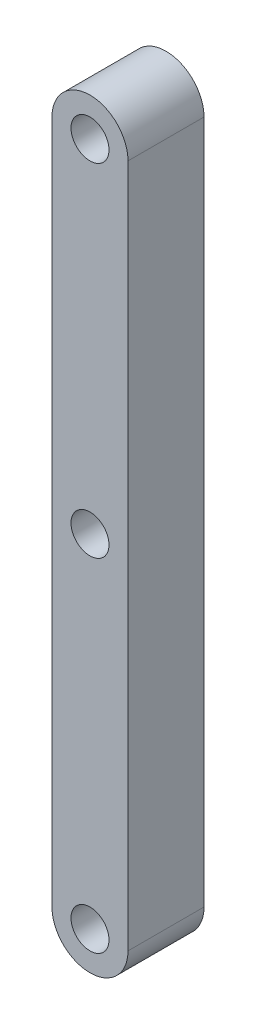
ISO-10303-21;
HEADER;
FILE_DESCRIPTION(('STEP AP214'),'2;1');
FILE_NAME('part.step','',(''),(''),'','','');
FILE_SCHEMA(('AUTOMOTIVE_DESIGN { 1 0 10303 214 1 1 1 1 }'));
ENDSEC;
DATA;
#1=APPLICATION_CONTEXT('core data for automotive mechanical design processes');
#2=APPLICATION_PROTOCOL_DEFINITION('international standard','automotive_design',2000,#1);
#3=PRODUCT_CONTEXT('',#1,'mechanical');
#4=PRODUCT('Part','Part','',(#3));
#5=PRODUCT_RELATED_PRODUCT_CATEGORY('part','',(#4));
#6=PRODUCT_DEFINITION_FORMATION('','',#4);
#7=PRODUCT_DEFINITION_CONTEXT('part definition',#1,'design');
#8=PRODUCT_DEFINITION('design','',#6,#7);
#9=PRODUCT_DEFINITION_SHAPE('','',#8);
#10=(LENGTH_UNIT() NAMED_UNIT(*) SI_UNIT(.MILLI.,.METRE.));
#11=(NAMED_UNIT(*) PLANE_ANGLE_UNIT() SI_UNIT($,.RADIAN.));
#12=(NAMED_UNIT(*) SI_UNIT($,.STERADIAN.) SOLID_ANGLE_UNIT());
#13=UNCERTAINTY_MEASURE_WITH_UNIT(LENGTH_MEASURE(1.E-05),#10,'distance_accuracy_value','');
#14=(GEOMETRIC_REPRESENTATION_CONTEXT(3) GLOBAL_UNCERTAINTY_ASSIGNED_CONTEXT((#13)) GLOBAL_UNIT_ASSIGNED_CONTEXT((#10,
#11,#12)) REPRESENTATION_CONTEXT('',''));
#15=CARTESIAN_POINT('',(0.,0.,0.));
#16=DIRECTION('',(0.,0.,1.));
#17=DIRECTION('',(1.,0.,0.));
#18=AXIS2_PLACEMENT_3D('',#15,#16,#17);
#19=CARTESIAN_POINT('',(0.,0.,10.));
#20=DIRECTION('',(0.,0.,-1.));
#21=DIRECTION('',(-1.,0.,0.));
#22=AXIS2_PLACEMENT_3D('',#19,#20,#21);
#23=CYLINDRICAL_SURFACE('',#22,5.);
#24=CARTESIAN_POINT('',(0.,0.,0.));
#25=DIRECTION('',(0.,0.,1.));
#26=DIRECTION('',(1.,0.,0.));
#27=AXIS2_PLACEMENT_3D('',#24,#25,#26);
#28=CIRCLE('',#27,5.);
#29=CARTESIAN_POINT('',(-5.,0.,0.));
#30=VERTEX_POINT('',#29);
#31=CARTESIAN_POINT('',(5.,0.,0.));
#32=VERTEX_POINT('',#31);
#33=EDGE_CURVE('E112',#30,#32,#28,.T.);
#34=ORIENTED_EDGE('',*,*,#33,.T.);
#35=DIRECTION('',(0.,0.,-1.));
#36=VECTOR('',#35,1.);
#37=CARTESIAN_POINT('',(5.,0.,10.));
#38=LINE('',#37,#36);
#39=CARTESIAN_POINT('',(5.,0.,10.));
#40=VERTEX_POINT('',#39);
#41=EDGE_CURVE('E11',#40,#32,#38,.T.);
#42=ORIENTED_EDGE('',*,*,#41,.F.);
#43=CARTESIAN_POINT('',(0.,0.,10.));
#44=DIRECTION('',(0.,0.,1.));
#45=DIRECTION('',(1.,0.,0.));
#46=AXIS2_PLACEMENT_3D('',#43,#44,#45);
#47=CIRCLE('',#46,5.);
#48=CARTESIAN_POINT('',(-5.,0.,10.));
#49=VERTEX_POINT('',#48);
#50=EDGE_CURVE('E96',#49,#40,#47,.T.);
#51=ORIENTED_EDGE('',*,*,#50,.F.);
#52=DIRECTION('',(0.,0.,-1.));
#53=VECTOR('',#52,1.);
#54=CARTESIAN_POINT('',(-5.,0.,10.));
#55=LINE('',#54,#53);
#56=EDGE_CURVE('E108',#49,#30,#55,.T.);
#57=ORIENTED_EDGE('',*,*,#56,.T.);
#58=EDGE_LOOP('',(#34,#42,#51,#57));
#59=FACE_BOUND('',#58,.T.);
#60=ADVANCED_FACE('F44',(#59),#23,.T.);
#61=CARTESIAN_POINT('',(5.,0.,10.));
#62=DIRECTION('',(-1.,0.,0.));
#63=DIRECTION('',(0.,0.,1.));
#64=AXIS2_PLACEMENT_3D('',#61,#62,#63);
#65=PLANE('',#64);
#66=DIRECTION('',(0.,1.,0.));
#67=VECTOR('',#66,1.);
#68=CARTESIAN_POINT('',(5.,0.,0.));
#69=LINE('',#68,#67);
#70=CARTESIAN_POINT('',(5.,90.,0.));
#71=VERTEX_POINT('',#70);
#72=EDGE_CURVE('E101',#32,#71,#69,.T.);
#73=ORIENTED_EDGE('',*,*,#72,.T.);
#74=DIRECTION('',(0.,0.,-1.));
#75=VECTOR('',#74,1.);
#76=CARTESIAN_POINT('',(5.,90.,10.));
#77=LINE('',#76,#75);
#78=CARTESIAN_POINT('',(5.,90.,10.));
#79=VERTEX_POINT('',#78);
#80=EDGE_CURVE('E53',#79,#71,#77,.T.);
#81=ORIENTED_EDGE('',*,*,#80,.F.);
#82=DIRECTION('',(0.,1.,0.));
#83=VECTOR('',#82,1.);
#84=CARTESIAN_POINT('',(5.,0.,10.));
#85=LINE('',#84,#83);
#86=EDGE_CURVE('E91',#40,#79,#85,.T.);
#87=ORIENTED_EDGE('',*,*,#86,.F.);
#88=ORIENTED_EDGE('',*,*,#41,.T.);
#89=EDGE_LOOP('',(#73,#81,#87,#88));
#90=FACE_BOUND('',#89,.T.);
#91=ADVANCED_FACE('F100',(#90),#65,.F.);
#92=CARTESIAN_POINT('',(0.,90.,10.));
#93=DIRECTION('',(0.,0.,-1.));
#94=DIRECTION('',(-1.,0.,0.));
#95=AXIS2_PLACEMENT_3D('',#92,#93,#94);
#96=CYLINDRICAL_SURFACE('',#95,5.);
#97=CARTESIAN_POINT('',(0.,90.,0.));
#98=DIRECTION('',(0.,0.,1.));
#99=DIRECTION('',(1.,0.,0.));
#100=AXIS2_PLACEMENT_3D('',#97,#98,#99);
#101=CIRCLE('',#100,5.);
#102=CARTESIAN_POINT('',(-5.,90.,0.));
#103=VERTEX_POINT('',#102);
#104=EDGE_CURVE('E78',#71,#103,#101,.T.);
#105=ORIENTED_EDGE('',*,*,#104,.T.);
#106=DIRECTION('',(0.,0.,-1.));
#107=VECTOR('',#106,1.);
#108=CARTESIAN_POINT('',(-5.,90.,10.));
#109=LINE('',#108,#107);
#110=CARTESIAN_POINT('',(-5.,90.,10.));
#111=VERTEX_POINT('',#110);
#112=EDGE_CURVE('E103',#111,#103,#109,.T.);
#113=ORIENTED_EDGE('',*,*,#112,.F.);
#114=CARTESIAN_POINT('',(0.,90.,10.));
#115=DIRECTION('',(0.,0.,1.));
#116=DIRECTION('',(1.,0.,0.));
#117=AXIS2_PLACEMENT_3D('',#114,#115,#116);
#118=CIRCLE('',#117,5.);
#119=EDGE_CURVE('E94',#79,#111,#118,.T.);
#120=ORIENTED_EDGE('',*,*,#119,.F.);
#121=ORIENTED_EDGE('',*,*,#80,.T.);
#122=EDGE_LOOP('',(#105,#113,#120,#121));
#123=FACE_BOUND('',#122,.T.);
#124=ADVANCED_FACE('F104',(#123),#96,.T.);
#125=CARTESIAN_POINT('',(-5.,0.,10.));
#126=DIRECTION('',(1.,0.,0.));
#127=DIRECTION('',(0.,1.,0.));
#128=AXIS2_PLACEMENT_3D('',#125,#126,#127);
#129=PLANE('',#128);
#130=DIRECTION('',(0.,-1.,0.));
#131=VECTOR('',#130,1.);
#132=CARTESIAN_POINT('',(-5.,0.,0.));
#133=LINE('',#132,#131);
#134=EDGE_CURVE('E84',#103,#30,#133,.T.);
#135=ORIENTED_EDGE('',*,*,#134,.T.);
#136=ORIENTED_EDGE('',*,*,#56,.F.);
#137=DIRECTION('',(0.,-1.,0.));
#138=VECTOR('',#137,1.);
#139=CARTESIAN_POINT('',(-5.,0.,10.));
#140=LINE('',#139,#138);
#141=EDGE_CURVE('E61',#111,#49,#140,.T.);
#142=ORIENTED_EDGE('',*,*,#141,.F.);
#143=ORIENTED_EDGE('',*,*,#112,.T.);
#144=EDGE_LOOP('',(#135,#136,#142,#143));
#145=FACE_BOUND('',#144,.T.);
#146=ADVANCED_FACE('F126',(#145),#129,.F.);
#147=CARTESIAN_POINT('',(0.,0.,10.));
#148=DIRECTION('',(0.,0.,1.));
#149=DIRECTION('',(1.,0.,0.));
#150=AXIS2_PLACEMENT_3D('',#147,#148,#149);
#151=PLANE('',#150);
#152=CARTESIAN_POINT('',(0.,0.,10.));
#153=DIRECTION('',(0.,0.,1.));
#154=DIRECTION('',(1.,0.,0.));
#155=AXIS2_PLACEMENT_3D('',#152,#153,#154);
#156=CIRCLE('',#155,2.5);
#157=CARTESIAN_POINT('',(2.5,0.,10.));
#158=VERTEX_POINT('',#157);
#159=EDGE_CURVE('E149',#158,#158,#156,.T.);
#160=ORIENTED_EDGE('',*,*,#159,.F.);
#161=EDGE_LOOP('',(#160));
#162=FACE_BOUND('',#161,.T.);
#163=CARTESIAN_POINT('',(0.,90.,10.));
#164=DIRECTION('',(0.,0.,1.));
#165=DIRECTION('',(1.,0.,0.));
#166=AXIS2_PLACEMENT_3D('',#163,#164,#165);
#167=CIRCLE('',#166,2.5);
#168=CARTESIAN_POINT('',(2.5,90.,10.));
#169=VERTEX_POINT('',#168);
#170=EDGE_CURVE('E141',#169,#169,#167,.T.);
#171=ORIENTED_EDGE('',*,*,#170,.F.);
#172=EDGE_LOOP('',(#171));
#173=FACE_BOUND('',#172,.T.);
#174=CARTESIAN_POINT('',(0.,45.,10.));
#175=DIRECTION('',(0.,0.,-1.));
#176=DIRECTION('',(-1.,0.,0.));
#177=AXIS2_PLACEMENT_3D('',#174,#175,#176);
#178=CIRCLE('',#177,2.5);
#179=CARTESIAN_POINT('',(-2.5,45.,10.));
#180=VERTEX_POINT('',#179);
#181=EDGE_CURVE('E116',#180,#180,#178,.T.);
#182=ORIENTED_EDGE('',*,*,#181,.T.);
#183=EDGE_LOOP('',(#182));
#184=FACE_BOUND('',#183,.T.);
#185=ORIENTED_EDGE('',*,*,#50,.T.);
#186=ORIENTED_EDGE('',*,*,#86,.T.);
#187=ORIENTED_EDGE('',*,*,#119,.T.);
#188=ORIENTED_EDGE('',*,*,#141,.T.);
#189=EDGE_LOOP('',(#185,#186,#187,#188));
#190=FACE_BOUND('',#189,.T.);
#191=ADVANCED_FACE('F92',(#162,#173,#184,#190),#151,.T.);
#192=CARTESIAN_POINT('',(0.,0.,0.));
#193=DIRECTION('',(0.,0.,1.));
#194=DIRECTION('',(1.,0.,0.));
#195=AXIS2_PLACEMENT_3D('',#192,#193,#194);
#196=PLANE('',#195);
#197=CARTESIAN_POINT('',(0.,0.,0.));
#198=DIRECTION('',(0.,0.,1.));
#199=DIRECTION('',(1.,0.,0.));
#200=AXIS2_PLACEMENT_3D('',#197,#198,#199);
#201=CIRCLE('',#200,2.5);
#202=CARTESIAN_POINT('',(2.5,0.,0.));
#203=VERTEX_POINT('',#202);
#204=EDGE_CURVE('E145',#203,#203,#201,.T.);
#205=ORIENTED_EDGE('',*,*,#204,.T.);
#206=EDGE_LOOP('',(#205));
#207=FACE_BOUND('',#206,.T.);
#208=CARTESIAN_POINT('',(0.,90.,0.));
#209=DIRECTION('',(0.,0.,1.));
#210=DIRECTION('',(1.,0.,0.));
#211=AXIS2_PLACEMENT_3D('',#208,#209,#210);
#212=CIRCLE('',#211,2.5);
#213=CARTESIAN_POINT('',(2.5,90.,0.));
#214=VERTEX_POINT('',#213);
#215=EDGE_CURVE('E137',#214,#214,#212,.T.);
#216=ORIENTED_EDGE('',*,*,#215,.T.);
#217=EDGE_LOOP('',(#216));
#218=FACE_BOUND('',#217,.T.);
#219=CARTESIAN_POINT('',(0.,45.,0.));
#220=DIRECTION('',(0.,0.,-1.));
#221=DIRECTION('',(-1.,0.,0.));
#222=AXIS2_PLACEMENT_3D('',#219,#220,#221);
#223=CIRCLE('',#222,2.5);
#224=CARTESIAN_POINT('',(-2.5,45.,0.));
#225=VERTEX_POINT('',#224);
#226=EDGE_CURVE('E133',#225,#225,#223,.T.);
#227=ORIENTED_EDGE('',*,*,#226,.F.);
#228=EDGE_LOOP('',(#227));
#229=FACE_BOUND('',#228,.T.);
#230=ORIENTED_EDGE('',*,*,#33,.F.);
#231=ORIENTED_EDGE('',*,*,#134,.F.);
#232=ORIENTED_EDGE('',*,*,#104,.F.);
#233=ORIENTED_EDGE('',*,*,#72,.F.);
#234=EDGE_LOOP('',(#230,#231,#232,#233));
#235=FACE_BOUND('',#234,.T.);
#236=ADVANCED_FACE('F129',(#207,#218,#229,#235),#196,.F.);
#237=CARTESIAN_POINT('',(0.,45.,10.));
#238=DIRECTION('',(0.,0.,-1.));
#239=DIRECTION('',(-1.,0.,0.));
#240=AXIS2_PLACEMENT_3D('',#237,#238,#239);
#241=CYLINDRICAL_SURFACE('',#240,2.5);
#242=ORIENTED_EDGE('',*,*,#181,.F.);
#243=EDGE_LOOP('',(#242));
#244=FACE_BOUND('',#243,.T.);
#245=ORIENTED_EDGE('',*,*,#226,.T.);
#246=EDGE_LOOP('',(#245));
#247=FACE_BOUND('',#246,.T.);
#248=ADVANCED_FACE('F173',(#244,#247),#241,.F.);
#249=CARTESIAN_POINT('',(0.,90.,0.));
#250=DIRECTION('',(0.,0.,1.));
#251=DIRECTION('',(1.,0.,0.));
#252=AXIS2_PLACEMENT_3D('',#249,#250,#251);
#253=CYLINDRICAL_SURFACE('',#252,2.5);
#254=ORIENTED_EDGE('',*,*,#215,.F.);
#255=EDGE_LOOP('',(#254));
#256=FACE_BOUND('',#255,.T.);
#257=ORIENTED_EDGE('',*,*,#170,.T.);
#258=EDGE_LOOP('',(#257));
#259=FACE_BOUND('',#258,.T.);
#260=ADVANCED_FACE('F162',(#256,#259),#253,.F.);
#261=CARTESIAN_POINT('',(0.,0.,0.));
#262=DIRECTION('',(0.,0.,1.));
#263=DIRECTION('',(1.,0.,0.));
#264=AXIS2_PLACEMENT_3D('',#261,#262,#263);
#265=CYLINDRICAL_SURFACE('',#264,2.5);
#266=ORIENTED_EDGE('',*,*,#204,.F.);
#267=EDGE_LOOP('',(#266));
#268=FACE_BOUND('',#267,.T.);
#269=ORIENTED_EDGE('',*,*,#159,.T.);
#270=EDGE_LOOP('',(#269));
#271=FACE_BOUND('',#270,.T.);
#272=ADVANCED_FACE('F159',(#268,#271),#265,.F.);
#273=CLOSED_SHELL('',(#60,#91,#124,#146,#191,#236,#248,#260,#272));
#274=MANIFOLD_SOLID_BREP('B2',#273);
#275=ADVANCED_BREP_SHAPE_REPRESENTATION('',(#18,#274),#14);
#276=SHAPE_DEFINITION_REPRESENTATION(#9,#275);
ENDSEC;
END-ISO-10303-21;
